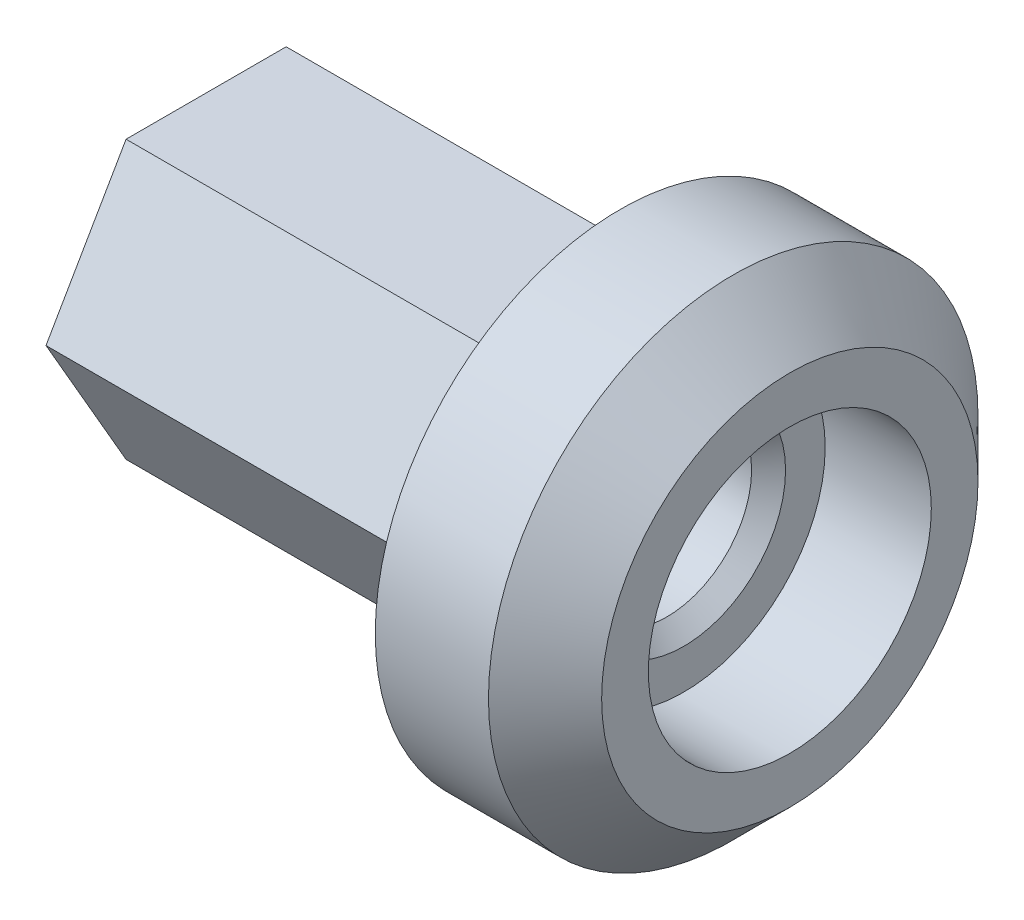
ISO-10303-21;
HEADER;
FILE_DESCRIPTION(('STEP AP214'),'2;1');
FILE_NAME('part.step','',(''),(''),'','','');
FILE_SCHEMA(('AUTOMOTIVE_DESIGN { 1 0 10303 214 1 1 1 1 }'));
ENDSEC;
DATA;
#1=APPLICATION_CONTEXT('core data for automotive mechanical design processes');
#2=APPLICATION_PROTOCOL_DEFINITION('international standard','automotive_design',2000,#1);
#3=PRODUCT_CONTEXT('',#1,'mechanical');
#4=PRODUCT('Part','Part','',(#3));
#5=PRODUCT_RELATED_PRODUCT_CATEGORY('part','',(#4));
#6=PRODUCT_DEFINITION_FORMATION('','',#4);
#7=PRODUCT_DEFINITION_CONTEXT('part definition',#1,'design');
#8=PRODUCT_DEFINITION('design','',#6,#7);
#9=PRODUCT_DEFINITION_SHAPE('','',#8);
#10=(LENGTH_UNIT() NAMED_UNIT(*) SI_UNIT(.MILLI.,.METRE.));
#11=(NAMED_UNIT(*) PLANE_ANGLE_UNIT() SI_UNIT($,.RADIAN.));
#12=(NAMED_UNIT(*) SI_UNIT($,.STERADIAN.) SOLID_ANGLE_UNIT());
#13=UNCERTAINTY_MEASURE_WITH_UNIT(LENGTH_MEASURE(1.E-05),#10,'distance_accuracy_value','');
#14=(GEOMETRIC_REPRESENTATION_CONTEXT(3) GLOBAL_UNCERTAINTY_ASSIGNED_CONTEXT((#13)) GLOBAL_UNIT_ASSIGNED_CONTEXT((#10,
#11,#12)) REPRESENTATION_CONTEXT('',''));
#15=CARTESIAN_POINT('',(0.,0.,0.));
#16=DIRECTION('',(0.,0.,1.));
#17=DIRECTION('',(1.,0.,0.));
#18=AXIS2_PLACEMENT_3D('',#15,#16,#17);
#19=CARTESIAN_POINT('',(-38.8590790331401,0.,0.));
#20=DIRECTION('',(1.,0.,0.));
#21=DIRECTION('',(0.,0.,-1.));
#22=AXIS2_PLACEMENT_3D('',#19,#20,#21);
#23=CYLINDRICAL_SURFACE('',#22,3.81);
#24=CARTESIAN_POINT('',(2.0955,0.,0.));
#25=DIRECTION('',(1.,0.,0.));
#26=DIRECTION('',(0.,0.,-1.));
#27=AXIS2_PLACEMENT_3D('',#24,#25,#26);
#28=CIRCLE('',#27,3.81);
#29=CARTESIAN_POINT('',(2.0955,0.,-3.81));
#30=VERTEX_POINT('',#29);
#31=EDGE_CURVE('E49',#30,#30,#28,.T.);
#32=ORIENTED_EDGE('',*,*,#31,.T.);
#33=EDGE_LOOP('',(#32));
#34=FACE_BOUND('',#33,.T.);
#35=CARTESIAN_POINT('',(-17.8155,0.,0.));
#36=DIRECTION('',(-1.,0.,0.));
#37=DIRECTION('',(0.,0.,1.));
#38=AXIS2_PLACEMENT_3D('',#35,#36,#37);
#39=CIRCLE('',#38,3.81);
#40=CARTESIAN_POINT('',(-17.8155,0.,3.81));
#41=VERTEX_POINT('',#40);
#42=EDGE_CURVE('E138',#41,#41,#39,.T.);
#43=ORIENTED_EDGE('',*,*,#42,.T.);
#44=EDGE_LOOP('',(#43));
#45=FACE_BOUND('',#44,.T.);
#46=ADVANCED_FACE('F40',(#34,#45),#23,.F.);
#47=CARTESIAN_POINT('',(-38.8590790331401,0.,-7.18570145033408));
#48=DIRECTION('',(0.,0.5,-0.866025403784438));
#49=DIRECTION('',(0.,0.866025403784438,0.5));
#50=AXIS2_PLACEMENT_3D('',#47,#48,#49);
#51=PLANE('',#50);
#52=DIRECTION('',(1.,0.,0.));
#53=VECTOR('',#52,1.);
#54=CARTESIAN_POINT('',(-38.8590790331401,0.,-7.18570145033408));
#55=LINE('',#54,#53);
#56=CARTESIAN_POINT('',(-18.5775,0.,-7.18570145033408));
#57=VERTEX_POINT('',#56);
#58=CARTESIAN_POINT('',(0.,0.,-7.18570145033408));
#59=VERTEX_POINT('',#58);
#60=EDGE_CURVE('E101',#57,#59,#55,.T.);
#61=ORIENTED_EDGE('',*,*,#60,.F.);
#62=DIRECTION('',(0.,0.866025403784438,0.5));
#63=VECTOR('',#62,1.);
#64=CARTESIAN_POINT('',(-18.5775,0.,-7.18570145033408));
#65=LINE('',#64,#63);
#66=CARTESIAN_POINT('',(-18.5775,6.223,-3.59285072516704));
#67=VERTEX_POINT('',#66);
#68=EDGE_CURVE('E127',#57,#67,#65,.T.);
#69=ORIENTED_EDGE('',*,*,#68,.T.);
#70=DIRECTION('',(1.,0.,0.));
#71=VECTOR('',#70,1.);
#72=CARTESIAN_POINT('',(-38.8590790331401,6.223,-3.59285072516704));
#73=LINE('',#72,#71);
#74=CARTESIAN_POINT('',(0.,6.223,-3.59285072516704));
#75=VERTEX_POINT('',#74);
#76=EDGE_CURVE('E125',#67,#75,#73,.T.);
#77=ORIENTED_EDGE('',*,*,#76,.T.);
#78=DIRECTION('',(0.,0.866025403784439,0.5));
#79=VECTOR('',#78,1.);
#80=CARTESIAN_POINT('',(0.,0.,-7.18570145033408));
#81=LINE('',#80,#79);
#82=EDGE_CURVE('E124',#59,#75,#81,.T.);
#83=ORIENTED_EDGE('',*,*,#82,.F.);
#84=EDGE_LOOP('',(#61,#69,#77,#83));
#85=FACE_BOUND('',#84,.T.);
#86=ADVANCED_FACE('F198',(#85),#51,.T.);
#87=CARTESIAN_POINT('',(-38.8590790331401,-6.223,-3.59285072516704));
#88=DIRECTION('',(0.,-0.499999999999999,-0.866025403784439));
#89=DIRECTION('',(0.,0.866025403784439,-0.5));
#90=AXIS2_PLACEMENT_3D('',#87,#88,#89);
#91=PLANE('',#90);
#92=DIRECTION('',(1.,0.,0.));
#93=VECTOR('',#92,1.);
#94=CARTESIAN_POINT('',(-38.8590790331401,-6.223,-3.59285072516704));
#95=LINE('',#94,#93);
#96=CARTESIAN_POINT('',(-18.5775,-6.223,-3.59285072516704));
#97=VERTEX_POINT('',#96);
#98=CARTESIAN_POINT('',(0.,-6.223,-3.59285072516704));
#99=VERTEX_POINT('',#98);
#100=EDGE_CURVE('E100',#97,#99,#95,.T.);
#101=ORIENTED_EDGE('',*,*,#100,.F.);
#102=DIRECTION('',(0.,0.866025403784439,-0.5));
#103=VECTOR('',#102,1.);
#104=CARTESIAN_POINT('',(-18.5775,-6.223,-3.59285072516704));
#105=LINE('',#104,#103);
#106=EDGE_CURVE('E97',#97,#57,#105,.T.);
#107=ORIENTED_EDGE('',*,*,#106,.T.);
#108=ORIENTED_EDGE('',*,*,#60,.T.);
#109=DIRECTION('',(0.,0.866025403784439,-0.5));
#110=VECTOR('',#109,1.);
#111=CARTESIAN_POINT('',(0.,-6.223,-3.59285072516704));
#112=LINE('',#111,#110);
#113=EDGE_CURVE('E132',#99,#59,#112,.T.);
#114=ORIENTED_EDGE('',*,*,#113,.F.);
#115=EDGE_LOOP('',(#101,#107,#108,#114));
#116=FACE_BOUND('',#115,.T.);
#117=ADVANCED_FACE('F184',(#116),#91,.T.);
#118=CARTESIAN_POINT('',(-38.8590790331401,-6.223,3.59285072516704));
#119=DIRECTION('',(0.,-1.,0.));
#120=DIRECTION('',(0.,0.,-1.));
#121=AXIS2_PLACEMENT_3D('',#118,#119,#120);
#122=PLANE('',#121);
#123=DIRECTION('',(1.,0.,0.));
#124=VECTOR('',#123,1.);
#125=CARTESIAN_POINT('',(-38.8590790331401,-6.223,3.59285072516704));
#126=LINE('',#125,#124);
#127=CARTESIAN_POINT('',(-18.5775,-6.223,3.59285072516704));
#128=VERTEX_POINT('',#127);
#129=CARTESIAN_POINT('',(0.,-6.223,3.59285072516704));
#130=VERTEX_POINT('',#129);
#131=EDGE_CURVE('E104',#128,#130,#126,.T.);
#132=ORIENTED_EDGE('',*,*,#131,.F.);
#133=DIRECTION('',(0.,0.,-1.));
#134=VECTOR('',#133,1.);
#135=CARTESIAN_POINT('',(-18.5775,-6.223,3.59285072516704));
#136=LINE('',#135,#134);
#137=EDGE_CURVE('E90',#128,#97,#136,.T.);
#138=ORIENTED_EDGE('',*,*,#137,.T.);
#139=ORIENTED_EDGE('',*,*,#100,.T.);
#140=DIRECTION('',(0.,0.,-1.));
#141=VECTOR('',#140,1.);
#142=CARTESIAN_POINT('',(0.,-6.223,3.59285072516704));
#143=LINE('',#142,#141);
#144=EDGE_CURVE('E107',#130,#99,#143,.T.);
#145=ORIENTED_EDGE('',*,*,#144,.F.);
#146=EDGE_LOOP('',(#132,#138,#139,#145));
#147=FACE_BOUND('',#146,.T.);
#148=ADVANCED_FACE('F105',(#147),#122,.T.);
#149=CARTESIAN_POINT('',(-38.8590790331401,0.,7.18570145033408));
#150=DIRECTION('',(0.,-0.5,0.866025403784438));
#151=DIRECTION('',(0.,-0.866025403784439,-0.5));
#152=AXIS2_PLACEMENT_3D('',#149,#150,#151);
#153=PLANE('',#152);
#154=DIRECTION('',(1.,0.,0.));
#155=VECTOR('',#154,1.);
#156=CARTESIAN_POINT('',(-38.8590790331401,0.,7.18570145033408));
#157=LINE('',#156,#155);
#158=CARTESIAN_POINT('',(-18.5775,0.,7.18570145033408));
#159=VERTEX_POINT('',#158);
#160=CARTESIAN_POINT('',(0.,0.,7.18570145033408));
#161=VERTEX_POINT('',#160);
#162=EDGE_CURVE('E113',#159,#161,#157,.T.);
#163=ORIENTED_EDGE('',*,*,#162,.F.);
#164=DIRECTION('',(0.,-0.866025403784439,-0.5));
#165=VECTOR('',#164,1.);
#166=CARTESIAN_POINT('',(-18.5775,0.,7.18570145033408));
#167=LINE('',#166,#165);
#168=EDGE_CURVE('E94',#159,#128,#167,.T.);
#169=ORIENTED_EDGE('',*,*,#168,.T.);
#170=ORIENTED_EDGE('',*,*,#131,.T.);
#171=DIRECTION('',(0.,-0.866025403784439,-0.5));
#172=VECTOR('',#171,1.);
#173=CARTESIAN_POINT('',(0.,0.,7.18570145033408));
#174=LINE('',#173,#172);
#175=EDGE_CURVE('E172',#161,#130,#174,.T.);
#176=ORIENTED_EDGE('',*,*,#175,.F.);
#177=EDGE_LOOP('',(#163,#169,#170,#176));
#178=FACE_BOUND('',#177,.T.);
#179=ADVANCED_FACE('F112',(#178),#153,.T.);
#180=CARTESIAN_POINT('',(-38.8590790331401,6.223,3.59285072516704));
#181=DIRECTION('',(0.,0.499999999999999,0.866025403784439));
#182=DIRECTION('',(0.,-0.866025403784439,0.499999999999999));
#183=AXIS2_PLACEMENT_3D('',#180,#181,#182);
#184=PLANE('',#183);
#185=DIRECTION('',(1.,0.,0.));
#186=VECTOR('',#185,1.);
#187=CARTESIAN_POINT('',(-38.8590790331401,6.223,3.59285072516704));
#188=LINE('',#187,#186);
#189=CARTESIAN_POINT('',(-18.5775,6.223,3.59285072516704));
#190=VERTEX_POINT('',#189);
#191=CARTESIAN_POINT('',(0.,6.223,3.59285072516704));
#192=VERTEX_POINT('',#191);
#193=EDGE_CURVE('E122',#190,#192,#188,.T.);
#194=ORIENTED_EDGE('',*,*,#193,.F.);
#195=DIRECTION('',(0.,-0.866025403784439,0.499999999999999));
#196=VECTOR('',#195,1.);
#197=CARTESIAN_POINT('',(-18.5775,6.223,3.59285072516704));
#198=LINE('',#197,#196);
#199=EDGE_CURVE('E62',#190,#159,#198,.T.);
#200=ORIENTED_EDGE('',*,*,#199,.T.);
#201=ORIENTED_EDGE('',*,*,#162,.T.);
#202=DIRECTION('',(0.,-0.866025403784439,0.499999999999999));
#203=VECTOR('',#202,1.);
#204=CARTESIAN_POINT('',(0.,6.223,3.59285072516704));
#205=LINE('',#204,#203);
#206=EDGE_CURVE('E174',#192,#161,#205,.T.);
#207=ORIENTED_EDGE('',*,*,#206,.F.);
#208=EDGE_LOOP('',(#194,#200,#201,#207));
#209=FACE_BOUND('',#208,.T.);
#210=ADVANCED_FACE('F192',(#209),#184,.T.);
#211=CARTESIAN_POINT('',(-38.8590790331401,6.223,-3.59285072516704));
#212=DIRECTION('',(0.,1.,0.));
#213=DIRECTION('',(0.,0.,1.));
#214=AXIS2_PLACEMENT_3D('',#211,#212,#213);
#215=PLANE('',#214);
#216=ORIENTED_EDGE('',*,*,#76,.F.);
#217=DIRECTION('',(0.,0.,1.));
#218=VECTOR('',#217,1.);
#219=CARTESIAN_POINT('',(-18.5775,6.223,-3.59285072516704));
#220=LINE('',#219,#218);
#221=EDGE_CURVE('E56',#67,#190,#220,.T.);
#222=ORIENTED_EDGE('',*,*,#221,.T.);
#223=ORIENTED_EDGE('',*,*,#193,.T.);
#224=DIRECTION('',(0.,0.,1.));
#225=VECTOR('',#224,1.);
#226=CARTESIAN_POINT('',(0.,6.223,-3.59285072516704));
#227=LINE('',#226,#225);
#228=EDGE_CURVE('E177',#75,#192,#227,.T.);
#229=ORIENTED_EDGE('',*,*,#228,.F.);
#230=EDGE_LOOP('',(#216,#222,#223,#229));
#231=FACE_BOUND('',#230,.T.);
#232=ADVANCED_FACE('F195',(#231),#215,.T.);
#233=CARTESIAN_POINT('',(-18.5775,0.,0.));
#234=DIRECTION('',(-1.,0.,0.));
#235=DIRECTION('',(0.,0.866025403784436,0.500000000000005));
#236=AXIS2_PLACEMENT_3D('',#233,#234,#235);
#237=PLANE('',#236);
#238=CARTESIAN_POINT('',(-18.5775,0.,0.));
#239=DIRECTION('',(-1.,0.,0.));
#240=DIRECTION('',(0.,0.,1.));
#241=AXIS2_PLACEMENT_3D('',#238,#239,#240);
#242=CIRCLE('',#241,4.57199999999999);
#243=CARTESIAN_POINT('',(-18.5775,0.,4.57199999999999));
#244=VERTEX_POINT('',#243);
#245=EDGE_CURVE('E12',#244,#244,#242,.F.);
#246=ORIENTED_EDGE('',*,*,#245,.T.);
#247=EDGE_LOOP('',(#246));
#248=FACE_BOUND('',#247,.T.);
#249=ORIENTED_EDGE('',*,*,#68,.F.);
#250=ORIENTED_EDGE('',*,*,#106,.F.);
#251=ORIENTED_EDGE('',*,*,#137,.F.);
#252=ORIENTED_EDGE('',*,*,#168,.F.);
#253=ORIENTED_EDGE('',*,*,#199,.F.);
#254=ORIENTED_EDGE('',*,*,#221,.F.);
#255=EDGE_LOOP('',(#249,#250,#251,#252,#253,#254));
#256=FACE_BOUND('',#255,.T.);
#257=ADVANCED_FACE('F92',(#248,#256),#237,.T.);
#258=CARTESIAN_POINT('',(0.,0.,0.));
#259=DIRECTION('',(1.,0.,0.));
#260=DIRECTION('',(0.,0.,-1.));
#261=AXIS2_PLACEMENT_3D('',#258,#259,#260);
#262=PLANE('',#261);
#263=CARTESIAN_POINT('',(0.,0.,0.));
#264=DIRECTION('',(1.,0.,0.));
#265=DIRECTION('',(0.,0.,-1.));
#266=AXIS2_PLACEMENT_3D('',#263,#264,#265);
#267=CIRCLE('',#266,10.9855);
#268=CARTESIAN_POINT('',(0.,0.,10.9855));
#269=VERTEX_POINT('',#268);
#270=EDGE_CURVE('E161',#269,#269,#267,.T.);
#271=ORIENTED_EDGE('',*,*,#270,.F.);
#272=EDGE_LOOP('',(#271));
#273=FACE_BOUND('',#272,.T.);
#274=ORIENTED_EDGE('',*,*,#113,.T.);
#275=ORIENTED_EDGE('',*,*,#82,.T.);
#276=ORIENTED_EDGE('',*,*,#228,.T.);
#277=ORIENTED_EDGE('',*,*,#206,.T.);
#278=ORIENTED_EDGE('',*,*,#175,.T.);
#279=ORIENTED_EDGE('',*,*,#144,.T.);
#280=EDGE_LOOP('',(#274,#275,#276,#277,#278,#279));
#281=FACE_BOUND('',#280,.T.);
#282=ADVANCED_FACE('F188',(#273,#281),#262,.F.);
#283=CARTESIAN_POINT('',(7.62,0.,0.));
#284=DIRECTION('',(1.,0.,0.));
#285=DIRECTION('',(0.,0.,-1.));
#286=AXIS2_PLACEMENT_3D('',#283,#284,#285);
#287=PLANE('',#286);
#288=CARTESIAN_POINT('',(7.62,0.,0.));
#289=DIRECTION('',(1.,0.,0.));
#290=DIRECTION('',(0.,0.,-1.));
#291=AXIS2_PLACEMENT_3D('',#288,#289,#290);
#292=CIRCLE('',#291,8.44550000000001);
#293=CARTESIAN_POINT('',(7.62,0.,-8.44550000000001));
#294=VERTEX_POINT('',#293);
#295=EDGE_CURVE('E128',#294,#294,#292,.T.);
#296=ORIENTED_EDGE('',*,*,#295,.T.);
#297=EDGE_LOOP('',(#296));
#298=FACE_BOUND('',#297,.T.);
#299=CARTESIAN_POINT('',(7.62,0.,0.));
#300=DIRECTION('',(1.,0.,0.));
#301=DIRECTION('',(0.,0.,-1.));
#302=AXIS2_PLACEMENT_3D('',#299,#300,#301);
#303=CIRCLE('',#302,6.35);
#304=CARTESIAN_POINT('',(7.62,0.,-6.35));
#305=VERTEX_POINT('',#304);
#306=EDGE_CURVE('E162',#305,#305,#303,.T.);
#307=ORIENTED_EDGE('',*,*,#306,.F.);
#308=EDGE_LOOP('',(#307));
#309=FACE_BOUND('',#308,.T.);
#310=ADVANCED_FACE('F230',(#298,#309),#287,.T.);
#311=CARTESIAN_POINT('',(7.62,0.,0.));
#312=DIRECTION('',(-1.,0.,0.));
#313=DIRECTION('',(0.,0.,1.));
#314=AXIS2_PLACEMENT_3D('',#311,#312,#313);
#315=CYLINDRICAL_SURFACE('',#314,10.9855);
#316=CARTESIAN_POINT('',(5.08000000000001,0.,0.));
#317=DIRECTION('',(1.,0.,0.));
#318=DIRECTION('',(0.,0.,-1.));
#319=AXIS2_PLACEMENT_3D('',#316,#317,#318);
#320=CIRCLE('',#319,10.9855);
#321=CARTESIAN_POINT('',(5.08000000000001,0.,10.9855));
#322=VERTEX_POINT('',#321);
#323=EDGE_CURVE('E131',#322,#322,#320,.F.);
#324=CARTESIAN_POINT('',(5.08000000000001,0.,10.9855));
#325=CARTESIAN_POINT('',(5.02708333333334,0.,10.9855));
#326=CARTESIAN_POINT('',(4.97416666666667,0.,10.9855));
#327=CARTESIAN_POINT('',(4.86833333333334,0.,10.9855));
#328=CARTESIAN_POINT('',(4.81541666666667,0.,10.9855));
#329=CARTESIAN_POINT('',(4.70958333333334,0.,10.9855));
#330=CARTESIAN_POINT('',(4.65666666666667,0.,10.9855));
#331=CARTESIAN_POINT('',(4.55083333333334,0.,10.9855));
#332=CARTESIAN_POINT('',(4.49791666666667,0.,10.9855));
#333=CARTESIAN_POINT('',(4.39208333333334,0.,10.9855));
#334=CARTESIAN_POINT('',(4.33916666666667,0.,10.9855));
#335=CARTESIAN_POINT('',(4.23333333333334,0.,10.9855));
#336=CARTESIAN_POINT('',(4.18041666666667,0.,10.9855));
#337=CARTESIAN_POINT('',(4.07458333333334,0.,10.9855));
#338=CARTESIAN_POINT('',(4.02166666666667,0.,10.9855));
#339=CARTESIAN_POINT('',(3.91583333333334,0.,10.9855));
#340=CARTESIAN_POINT('',(3.86291666666667,0.,10.9855));
#341=CARTESIAN_POINT('',(3.75708333333334,0.,10.9855));
#342=CARTESIAN_POINT('',(3.70416666666667,0.,10.9855));
#343=CARTESIAN_POINT('',(3.59833333333334,0.,10.9855));
#344=CARTESIAN_POINT('',(3.54541666666667,0.,10.9855));
#345=CARTESIAN_POINT('',(3.43958333333334,0.,10.9855));
#346=CARTESIAN_POINT('',(3.38666666666667,0.,10.9855));
#347=CARTESIAN_POINT('',(3.28083333333334,0.,10.9855));
#348=CARTESIAN_POINT('',(3.22791666666667,0.,10.9855));
#349=CARTESIAN_POINT('',(3.12208333333334,0.,10.9855));
#350=CARTESIAN_POINT('',(3.06916666666667,0.,10.9855));
#351=CARTESIAN_POINT('',(2.96333333333334,0.,10.9855));
#352=CARTESIAN_POINT('',(2.91041666666667,0.,10.9855));
#353=CARTESIAN_POINT('',(2.80458333333334,0.,10.9855));
#354=CARTESIAN_POINT('',(2.75166666666667,0.,10.9855));
#355=CARTESIAN_POINT('',(2.64583333333334,0.,10.9855));
#356=CARTESIAN_POINT('',(2.59291666666667,0.,10.9855));
#357=CARTESIAN_POINT('',(2.48708333333334,0.,10.9855));
#358=CARTESIAN_POINT('',(2.43416666666667,0.,10.9855));
#359=CARTESIAN_POINT('',(2.32833333333334,0.,10.9855));
#360=CARTESIAN_POINT('',(2.27541666666667,0.,10.9855));
#361=CARTESIAN_POINT('',(2.16958333333334,0.,10.9855));
#362=CARTESIAN_POINT('',(2.11666666666667,0.,10.9855));
#363=CARTESIAN_POINT('',(2.01083333333334,0.,10.9855));
#364=CARTESIAN_POINT('',(1.95791666666667,0.,10.9855));
#365=CARTESIAN_POINT('',(1.85208333333334,0.,10.9855));
#366=CARTESIAN_POINT('',(1.79916666666667,0.,10.9855));
#367=CARTESIAN_POINT('',(1.69333333333334,0.,10.9855));
#368=CARTESIAN_POINT('',(1.64041666666667,0.,10.9855));
#369=CARTESIAN_POINT('',(1.53458333333334,0.,10.9855));
#370=CARTESIAN_POINT('',(1.48166666666667,0.,10.9855));
#371=CARTESIAN_POINT('',(1.37583333333334,0.,10.9855));
#372=CARTESIAN_POINT('',(1.32291666666667,0.,10.9855));
#373=CARTESIAN_POINT('',(1.21708333333334,0.,10.9855));
#374=CARTESIAN_POINT('',(1.16416666666667,0.,10.9855));
#375=CARTESIAN_POINT('',(1.05833333333334,0.,10.9855));
#376=CARTESIAN_POINT('',(1.00541666666667,0.,10.9855));
#377=CARTESIAN_POINT('',(0.899583333333335,0.,10.9855));
#378=CARTESIAN_POINT('',(0.846666666666668,0.,10.9855));
#379=CARTESIAN_POINT('',(0.740833333333334,0.,10.9855));
#380=CARTESIAN_POINT('',(0.687916666666668,0.,10.9855));
#381=CARTESIAN_POINT('',(0.582083333333334,0.,10.9855));
#382=CARTESIAN_POINT('',(0.529166666666668,0.,10.9855));
#383=CARTESIAN_POINT('',(0.423333333333334,0.,10.9855));
#384=CARTESIAN_POINT('',(0.370416666666668,0.,10.9855));
#385=CARTESIAN_POINT('',(0.264583333333334,0.,10.9855));
#386=CARTESIAN_POINT('',(0.211666666666667,0.,10.9855));
#387=CARTESIAN_POINT('',(0.105833333333333,0.,10.9855));
#388=CARTESIAN_POINT('',(0.0529166666666666,0.,10.9855));
#389=CARTESIAN_POINT('',(0.,0.,10.9855));
#390=B_SPLINE_CURVE_WITH_KNOTS('',3,(#324,#325,#326,#327,#328,#329,#330,#331,#332,#333,#334,
#335,#336,#337,#338,#339,#340,#341,#342,#343,#344,#345,#346,#347,#348,#349,#350,#351,#352,#353,
#354,#355,#356,#357,#358,#359,#360,#361,#362,#363,#364,#365,#366,#367,#368,#369,#370,#371,#372,
#373,#374,#375,#376,#377,#378,#379,#380,#381,#382,#383,#384,#385,#386,#387,#388,#389),
.UNSPECIFIED.,.F.,.F.,(4,2,2,2,2,2,2,2,2,2,2,2,2,2,2,2,2,2,2,2,2,2,2,2,2,2,2,2,2,2,2,2,4),(0.,
0.15875,0.3175,0.476250000000001,0.635,0.793750000000001,0.952500000000002,1.11125,1.27,1.42875,
1.5875,1.74625,1.905,2.06375,2.2225,2.38125,2.54,2.69875,2.8575,3.01625000000001,3.175,
3.33375000000001,3.49250000000001,3.65125,3.81000000000001,3.96875000000001,4.12750000000001,
4.28625000000001,4.44500000000001,4.60375000000001,4.76250000000001,4.92125000000001,
5.08000000000001),.UNSPECIFIED.);
#391=EDGE_CURVE('BSEAM155',#322,#269,#390,.T.);
#392=ORIENTED_EDGE('',*,*,#323,.T.);
#393=ORIENTED_EDGE('',*,*,#270,.T.);
#394=ORIENTED_EDGE('',*,*,#391,.T.);
#395=ORIENTED_EDGE('',*,*,#391,.F.);
#396=EDGE_LOOP('',(#392,#394,#393,#395));
#397=FACE_BOUND('',#396,.T.);
#398=ADVANCED_FACE('F155',(#397),#315,.T.);
#399=CARTESIAN_POINT('',(2.8575,0.,0.));
#400=DIRECTION('',(1.,0.,0.));
#401=DIRECTION('',(0.,0.,-1.));
#402=AXIS2_PLACEMENT_3D('',#399,#400,#401);
#403=PLANE('',#402);
#404=CARTESIAN_POINT('',(2.8575,0.,0.));
#405=DIRECTION('',(1.,0.,0.));
#406=DIRECTION('',(0.,0.,-1.));
#407=AXIS2_PLACEMENT_3D('',#404,#405,#406);
#408=CIRCLE('',#407,4.57199999999999);
#409=CARTESIAN_POINT('',(2.8575,0.,-4.57199999999999));
#410=VERTEX_POINT('',#409);
#411=EDGE_CURVE('E135',#410,#410,#408,.F.);
#412=ORIENTED_EDGE('',*,*,#411,.T.);
#413=EDGE_LOOP('',(#412));
#414=FACE_BOUND('',#413,.T.);
#415=CARTESIAN_POINT('',(2.8575,0.,0.));
#416=DIRECTION('',(1.,0.,0.));
#417=DIRECTION('',(0.,0.,-1.));
#418=AXIS2_PLACEMENT_3D('',#415,#416,#417);
#419=CIRCLE('',#418,6.35);
#420=CARTESIAN_POINT('',(2.8575,0.,-6.35));
#421=VERTEX_POINT('',#420);
#422=EDGE_CURVE('E159',#421,#421,#419,.T.);
#423=ORIENTED_EDGE('',*,*,#422,.T.);
#424=EDGE_LOOP('',(#423));
#425=FACE_BOUND('',#424,.T.);
#426=ADVANCED_FACE('F151',(#414,#425),#403,.T.);
#427=CARTESIAN_POINT('',(2.8575,0.,0.));
#428=DIRECTION('',(1.,0.,0.));
#429=DIRECTION('',(0.,0.,-1.));
#430=AXIS2_PLACEMENT_3D('',#427,#428,#429);
#431=CYLINDRICAL_SURFACE('',#430,6.35);
#432=CARTESIAN_POINT('',(2.8575,0.,-6.35));
#433=CARTESIAN_POINT('',(2.907109375,0.,-6.35));
#434=CARTESIAN_POINT('',(2.95671875,0.,-6.35));
#435=CARTESIAN_POINT('',(3.0559375,0.,-6.35));
#436=CARTESIAN_POINT('',(3.105546875,0.,-6.35));
#437=CARTESIAN_POINT('',(3.204765625,0.,-6.35));
#438=CARTESIAN_POINT('',(3.254375,0.,-6.35));
#439=CARTESIAN_POINT('',(3.35359375,0.,-6.35));
#440=CARTESIAN_POINT('',(3.403203125,0.,-6.35));
#441=CARTESIAN_POINT('',(3.502421875,0.,-6.35));
#442=CARTESIAN_POINT('',(3.55203125,0.,-6.35));
#443=CARTESIAN_POINT('',(3.65125,0.,-6.35));
#444=CARTESIAN_POINT('',(3.700859375,0.,-6.35));
#445=CARTESIAN_POINT('',(3.800078125,0.,-6.35));
#446=CARTESIAN_POINT('',(3.8496875,0.,-6.35));
#447=CARTESIAN_POINT('',(3.94890625,0.,-6.35));
#448=CARTESIAN_POINT('',(3.998515625,0.,-6.35));
#449=CARTESIAN_POINT('',(4.097734375,0.,-6.35));
#450=CARTESIAN_POINT('',(4.14734375,0.,-6.35));
#451=CARTESIAN_POINT('',(4.2465625,0.,-6.35));
#452=CARTESIAN_POINT('',(4.296171875,0.,-6.35));
#453=CARTESIAN_POINT('',(4.395390625,0.,-6.35));
#454=CARTESIAN_POINT('',(4.445,0.,-6.35));
#455=CARTESIAN_POINT('',(4.54421875,0.,-6.35));
#456=CARTESIAN_POINT('',(4.593828125,0.,-6.35));
#457=CARTESIAN_POINT('',(4.693046875,0.,-6.35));
#458=CARTESIAN_POINT('',(4.74265625,0.,-6.35));
#459=CARTESIAN_POINT('',(4.841875,0.,-6.35));
#460=CARTESIAN_POINT('',(4.891484375,0.,-6.35));
#461=CARTESIAN_POINT('',(4.990703125,0.,-6.35));
#462=CARTESIAN_POINT('',(5.0403125,0.,-6.35));
#463=CARTESIAN_POINT('',(5.13953125,0.,-6.35));
#464=CARTESIAN_POINT('',(5.189140625,0.,-6.35));
#465=CARTESIAN_POINT('',(5.288359375,0.,-6.35));
#466=CARTESIAN_POINT('',(5.33796875,0.,-6.35));
#467=CARTESIAN_POINT('',(5.4371875,0.,-6.35));
#468=CARTESIAN_POINT('',(5.486796875,0.,-6.35));
#469=CARTESIAN_POINT('',(5.586015625,0.,-6.35));
#470=CARTESIAN_POINT('',(5.635625,0.,-6.35));
#471=CARTESIAN_POINT('',(5.73484375,0.,-6.35));
#472=CARTESIAN_POINT('',(5.784453125,0.,-6.35));
#473=CARTESIAN_POINT('',(5.883671875,0.,-6.35));
#474=CARTESIAN_POINT('',(5.93328125,0.,-6.35));
#475=CARTESIAN_POINT('',(6.0325,0.,-6.35));
#476=CARTESIAN_POINT('',(6.082109375,0.,-6.35));
#477=CARTESIAN_POINT('',(6.181328125,0.,-6.35));
#478=CARTESIAN_POINT('',(6.2309375,0.,-6.35));
#479=CARTESIAN_POINT('',(6.33015625,0.,-6.35));
#480=CARTESIAN_POINT('',(6.379765625,0.,-6.35));
#481=CARTESIAN_POINT('',(6.478984375,0.,-6.35));
#482=CARTESIAN_POINT('',(6.52859375,0.,-6.35));
#483=CARTESIAN_POINT('',(6.6278125,0.,-6.35));
#484=CARTESIAN_POINT('',(6.677421875,0.,-6.35));
#485=CARTESIAN_POINT('',(6.776640625,0.,-6.35));
#486=CARTESIAN_POINT('',(6.82625,0.,-6.35));
#487=CARTESIAN_POINT('',(6.92546875,0.,-6.35));
#488=CARTESIAN_POINT('',(6.975078125,0.,-6.35));
#489=CARTESIAN_POINT('',(7.074296875,0.,-6.35));
#490=CARTESIAN_POINT('',(7.12390625,0.,-6.35));
#491=CARTESIAN_POINT('',(7.223125,0.,-6.35));
#492=CARTESIAN_POINT('',(7.272734375,0.,-6.35));
#493=CARTESIAN_POINT('',(7.371953125,0.,-6.35));
#494=CARTESIAN_POINT('',(7.4215625,0.,-6.35));
#495=CARTESIAN_POINT('',(7.52078125,0.,-6.35));
#496=CARTESIAN_POINT('',(7.570390625,0.,-6.35));
#497=CARTESIAN_POINT('',(7.62,0.,-6.35));
#498=B_SPLINE_CURVE_WITH_KNOTS('',3,(#432,#433,#434,#435,#436,#437,#438,#439,#440,#441,#442,
#443,#444,#445,#446,#447,#448,#449,#450,#451,#452,#453,#454,#455,#456,#457,#458,#459,#460,#461,
#462,#463,#464,#465,#466,#467,#468,#469,#470,#471,#472,#473,#474,#475,#476,#477,#478,#479,#480,
#481,#482,#483,#484,#485,#486,#487,#488,#489,#490,#491,#492,#493,#494,#495,#496,#497),
.UNSPECIFIED.,.F.,.F.,(4,2,2,2,2,2,2,2,2,2,2,2,2,2,2,2,2,2,2,2,2,2,2,2,2,2,2,2,2,2,2,2,4),(0.,
0.148828125,0.29765625,0.446484375,0.5953125,0.744140625,0.89296875,1.041796875,1.190625,
1.339453125,1.48828125,1.637109375,1.7859375,1.934765625,2.08359375,2.232421875,2.38125,
2.530078125,2.67890625,2.827734375,2.9765625,3.125390625,3.27421875,3.423046875,3.571875,
3.720703125,3.86953125,4.018359375,4.1671875,4.316015625,4.46484375,4.613671875,4.7625),.UNSPECIFIED.);
#499=EDGE_CURVE('BSEAM154',#421,#305,#498,.T.);
#500=ORIENTED_EDGE('',*,*,#422,.F.);
#501=ORIENTED_EDGE('',*,*,#306,.T.);
#502=ORIENTED_EDGE('',*,*,#499,.T.);
#503=ORIENTED_EDGE('',*,*,#499,.F.);
#504=EDGE_LOOP('',(#500,#502,#501,#503));
#505=FACE_BOUND('',#504,.T.);
#506=ADVANCED_FACE('F154',(#505),#431,.F.);
#507=CARTESIAN_POINT('',(7.62,0.,0.));
#508=DIRECTION('',(-1.,0.,0.));
#509=DIRECTION('',(0.,0.,1.));
#510=AXIS2_PLACEMENT_3D('',#507,#508,#509);
#511=CONICAL_SURFACE('',#510,8.44550000000001,0.785398163397447);
#512=ORIENTED_EDGE('',*,*,#323,.F.);
#513=EDGE_LOOP('',(#512));
#514=FACE_BOUND('',#513,.T.);
#515=ORIENTED_EDGE('',*,*,#295,.F.);
#516=EDGE_LOOP('',(#515));
#517=FACE_BOUND('',#516,.T.);
#518=ADVANCED_FACE('F148',(#514,#517),#511,.T.);
#519=CARTESIAN_POINT('',(2.8575,0.,0.));
#520=DIRECTION('',(1.,0.,0.));
#521=DIRECTION('',(0.,0.,-1.));
#522=AXIS2_PLACEMENT_3D('',#519,#520,#521);
#523=CONICAL_SURFACE('',#522,4.57199999999999,0.785398163397445);
#524=ORIENTED_EDGE('',*,*,#31,.F.);
#525=EDGE_LOOP('',(#524));
#526=FACE_BOUND('',#525,.T.);
#527=ORIENTED_EDGE('',*,*,#411,.F.);
#528=EDGE_LOOP('',(#527));
#529=FACE_BOUND('',#528,.T.);
#530=ADVANCED_FACE('F145',(#526,#529),#523,.F.);
#531=CARTESIAN_POINT('',(-18.5775,0.,0.));
#532=DIRECTION('',(-1.,0.,0.));
#533=DIRECTION('',(0.,0.,1.));
#534=AXIS2_PLACEMENT_3D('',#531,#532,#533);
#535=CONICAL_SURFACE('',#534,4.57199999999999,0.785398163397447);
#536=ORIENTED_EDGE('',*,*,#42,.F.);
#537=EDGE_LOOP('',(#536));
#538=FACE_BOUND('',#537,.T.);
#539=ORIENTED_EDGE('',*,*,#245,.F.);
#540=EDGE_LOOP('',(#539));
#541=FACE_BOUND('',#540,.T.);
#542=ADVANCED_FACE('F43',(#538,#541),#535,.F.);
#543=CLOSED_SHELL('',(#46,#86,#117,#148,#179,#210,#232,#257,#282,#310,#398,#426,#506,#518,#530,#542));
#544=MANIFOLD_SOLID_BREP('B2',#543);
#545=ADVANCED_BREP_SHAPE_REPRESENTATION('',(#18,#544),#14);
#546=SHAPE_DEFINITION_REPRESENTATION(#9,#545);
ENDSEC;
END-ISO-10303-21;
